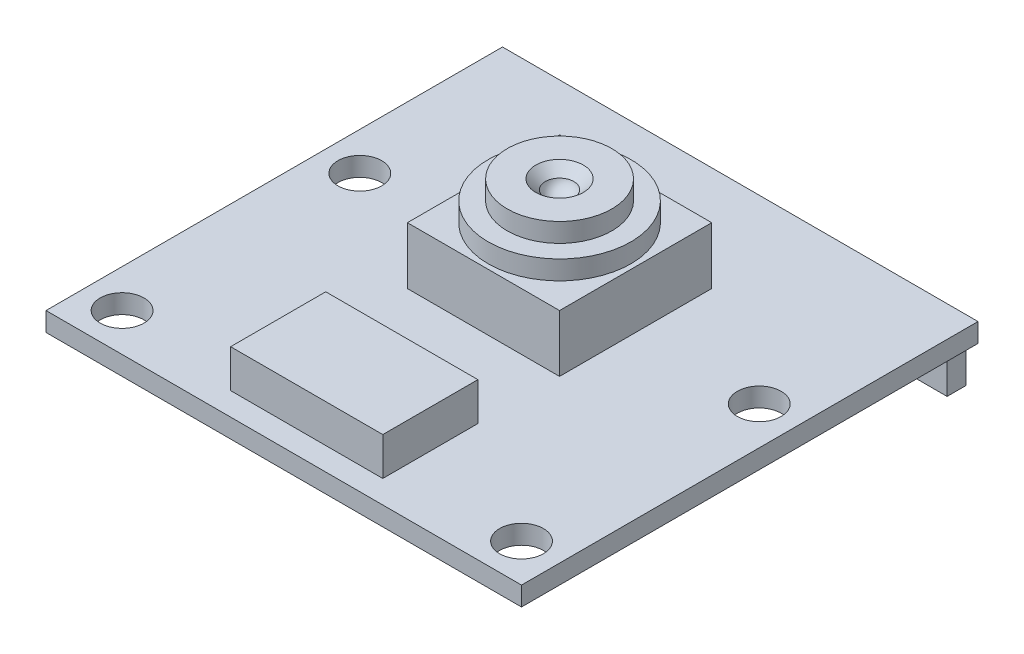
ISO-10303-21;
HEADER;
FILE_DESCRIPTION(('STEP AP214'),'2;1');
FILE_NAME('part.step','',(''),(''),'','','');
FILE_SCHEMA(('AUTOMOTIVE_DESIGN { 1 0 10303 214 1 1 1 1 }'));
ENDSEC;
DATA;
#1=APPLICATION_CONTEXT('core data for automotive mechanical design processes');
#2=APPLICATION_PROTOCOL_DEFINITION('international standard','automotive_design',2000,#1);
#3=PRODUCT_CONTEXT('',#1,'mechanical');
#4=PRODUCT('Part','Part','',(#3));
#5=PRODUCT_RELATED_PRODUCT_CATEGORY('part','',(#4));
#6=PRODUCT_DEFINITION_FORMATION('','',#4);
#7=PRODUCT_DEFINITION_CONTEXT('part definition',#1,'design');
#8=PRODUCT_DEFINITION('design','',#6,#7);
#9=PRODUCT_DEFINITION_SHAPE('','',#8);
#10=(LENGTH_UNIT() NAMED_UNIT(*) SI_UNIT(.MILLI.,.METRE.));
#11=(NAMED_UNIT(*) PLANE_ANGLE_UNIT() SI_UNIT($,.RADIAN.));
#12=(NAMED_UNIT(*) SI_UNIT($,.STERADIAN.) SOLID_ANGLE_UNIT());
#13=UNCERTAINTY_MEASURE_WITH_UNIT(LENGTH_MEASURE(1.E-05),#10,'distance_accuracy_value','');
#14=(GEOMETRIC_REPRESENTATION_CONTEXT(3) GLOBAL_UNCERTAINTY_ASSIGNED_CONTEXT((#13)) GLOBAL_UNIT_ASSIGNED_CONTEXT((#10,
#11,#12)) REPRESENTATION_CONTEXT('',''));
#15=CARTESIAN_POINT('',(0.,0.,0.));
#16=DIRECTION('',(0.,0.,1.));
#17=DIRECTION('',(1.,0.,0.));
#18=AXIS2_PLACEMENT_3D('',#15,#16,#17);
#19=CARTESIAN_POINT('',(0.,-2.,0.));
#20=DIRECTION('',(0.,1.,0.));
#21=DIRECTION('',(0.,0.,1.));
#22=AXIS2_PLACEMENT_3D('',#19,#20,#21);
#23=PLANE('',#22);
#24=DIRECTION('',(-1.,0.,0.));
#25=VECTOR('',#24,1.);
#26=CARTESIAN_POINT('',(12.,-2.,-10.875));
#27=LINE('',#26,#25);
#28=CARTESIAN_POINT('',(10.5,-2.,-10.875));
#29=VERTEX_POINT('',#28);
#30=CARTESIAN_POINT('',(-10.5,-2.,-10.875));
#31=VERTEX_POINT('',#30);
#32=EDGE_CURVE('E11',#29,#31,#27,.T.);
#33=ORIENTED_EDGE('',*,*,#32,.F.);
#34=DIRECTION('',(0.,0.,1.));
#35=VECTOR('',#34,1.);
#36=CARTESIAN_POINT('',(10.5,-2.,-10.875));
#37=LINE('',#36,#35);
#38=CARTESIAN_POINT('',(10.5,-2.,-6.625));
#39=VERTEX_POINT('',#38);
#40=EDGE_CURVE('E207',#29,#39,#37,.T.);
#41=ORIENTED_EDGE('',*,*,#40,.T.);
#42=DIRECTION('',(-1.,0.,0.));
#43=VECTOR('',#42,1.);
#44=CARTESIAN_POINT('',(10.5,-2.,-6.625));
#45=LINE('',#44,#43);
#46=CARTESIAN_POINT('',(-10.5,-2.,-6.625));
#47=VERTEX_POINT('',#46);
#48=EDGE_CURVE('E205',#39,#47,#45,.T.);
#49=ORIENTED_EDGE('',*,*,#48,.T.);
#50=DIRECTION('',(0.,0.,-1.));
#51=VECTOR('',#50,1.);
#52=CARTESIAN_POINT('',(-10.5,-2.,-10.875));
#53=LINE('',#52,#51);
#54=EDGE_CURVE('E183',#47,#31,#53,.T.);
#55=ORIENTED_EDGE('',*,*,#54,.T.);
#56=EDGE_LOOP('',(#33,#41,#49,#55));
#57=FACE_BOUND('',#56,.T.);
#58=ADVANCED_FACE('F35',(#57),#23,.F.);
#59=CARTESIAN_POINT('',(0.,0.,0.));
#60=DIRECTION('',(0.,1.,0.));
#61=DIRECTION('',(0.,0.,1.));
#62=AXIS2_PLACEMENT_3D('',#59,#60,#61);
#63=PLANE('',#62);
#64=DIRECTION('',(0.,0.,-1.));
#65=VECTOR('',#64,1.);
#66=CARTESIAN_POINT('',(12.5,0.,-12.));
#67=LINE('',#66,#65);
#68=CARTESIAN_POINT('',(12.5,0.,12.));
#69=VERTEX_POINT('',#68);
#70=CARTESIAN_POINT('',(12.5,0.,-12.));
#71=VERTEX_POINT('',#70);
#72=EDGE_CURVE('E328',#69,#71,#67,.T.);
#73=ORIENTED_EDGE('',*,*,#72,.F.);
#74=DIRECTION('',(1.,0.,0.));
#75=VECTOR('',#74,1.);
#76=CARTESIAN_POINT('',(-12.5,0.,12.));
#77=LINE('',#76,#75);
#78=CARTESIAN_POINT('',(-12.5,0.,12.));
#79=VERTEX_POINT('',#78);
#80=EDGE_CURVE('E335',#79,#69,#77,.T.);
#81=ORIENTED_EDGE('',*,*,#80,.F.);
#82=DIRECTION('',(0.,0.,1.));
#83=VECTOR('',#82,1.);
#84=CARTESIAN_POINT('',(-12.5,0.,-12.));
#85=LINE('',#84,#83);
#86=CARTESIAN_POINT('',(-12.5,0.,-12.));
#87=VERTEX_POINT('',#86);
#88=EDGE_CURVE('E346',#87,#79,#85,.T.);
#89=ORIENTED_EDGE('',*,*,#88,.F.);
#90=DIRECTION('',(-1.,0.,0.));
#91=VECTOR('',#90,1.);
#92=CARTESIAN_POINT('',(-12.5,0.,-12.));
#93=LINE('',#92,#91);
#94=EDGE_CURVE('E344',#71,#87,#93,.T.);
#95=ORIENTED_EDGE('',*,*,#94,.F.);
#96=EDGE_LOOP('',(#73,#81,#89,#95));
#97=FACE_BOUND('',#96,.T.);
#98=CARTESIAN_POINT('',(-10.5,0.,-2.5));
#99=DIRECTION('',(0.,1.,0.));
#100=DIRECTION('',(0.,0.,1.));
#101=AXIS2_PLACEMENT_3D('',#98,#99,#100);
#102=CIRCLE('',#101,1.15);
#103=CARTESIAN_POINT('',(-10.5,0.,-1.35));
#104=VERTEX_POINT('',#103);
#105=EDGE_CURVE('E325',#104,#104,#102,.T.);
#106=ORIENTED_EDGE('',*,*,#105,.T.);
#107=EDGE_LOOP('',(#106));
#108=FACE_BOUND('',#107,.T.);
#109=CARTESIAN_POINT('',(10.5,0.,-2.5));
#110=DIRECTION('',(0.,1.,0.));
#111=DIRECTION('',(0.,0.,1.));
#112=AXIS2_PLACEMENT_3D('',#109,#110,#111);
#113=CIRCLE('',#112,1.15);
#114=CARTESIAN_POINT('',(10.5,0.,-1.35));
#115=VERTEX_POINT('',#114);
#116=EDGE_CURVE('E319',#115,#115,#113,.T.);
#117=ORIENTED_EDGE('',*,*,#116,.T.);
#118=EDGE_LOOP('',(#117));
#119=FACE_BOUND('',#118,.T.);
#120=CARTESIAN_POINT('',(10.5,0.,10.));
#121=DIRECTION('',(0.,1.,0.));
#122=DIRECTION('',(0.,0.,1.));
#123=AXIS2_PLACEMENT_3D('',#120,#121,#122);
#124=CIRCLE('',#123,1.15);
#125=CARTESIAN_POINT('',(10.5,0.,11.15));
#126=VERTEX_POINT('',#125);
#127=EDGE_CURVE('E313',#126,#126,#124,.T.);
#128=ORIENTED_EDGE('',*,*,#127,.T.);
#129=EDGE_LOOP('',(#128));
#130=FACE_BOUND('',#129,.T.);
#131=CARTESIAN_POINT('',(-10.5,0.,10.));
#132=DIRECTION('',(0.,1.,0.));
#133=DIRECTION('',(0.,0.,1.));
#134=AXIS2_PLACEMENT_3D('',#131,#132,#133);
#135=CIRCLE('',#134,1.15);
#136=CARTESIAN_POINT('',(-10.5,0.,11.15));
#137=VERTEX_POINT('',#136);
#138=EDGE_CURVE('E307',#137,#137,#135,.T.);
#139=ORIENTED_EDGE('',*,*,#138,.T.);
#140=EDGE_LOOP('',(#139));
#141=FACE_BOUND('',#140,.T.);
#142=DIRECTION('',(-1.,0.,0.));
#143=VECTOR('',#142,1.);
#144=CARTESIAN_POINT('',(12.,0.,-10.875));
#145=LINE('',#144,#143);
#146=CARTESIAN_POINT('',(12.,0.,-10.875));
#147=VERTEX_POINT('',#146);
#148=CARTESIAN_POINT('',(10.5,0.,-10.875));
#149=VERTEX_POINT('',#148);
#150=EDGE_CURVE('E204',#147,#149,#145,.T.);
#151=ORIENTED_EDGE('',*,*,#150,.F.);
#152=DIRECTION('',(0.,0.,1.));
#153=VECTOR('',#152,1.);
#154=CARTESIAN_POINT('',(12.,0.,-11.875));
#155=LINE('',#154,#153);
#156=CARTESIAN_POINT('',(12.,0.,-11.875));
#157=VERTEX_POINT('',#156);
#158=EDGE_CURVE('E179',#157,#147,#155,.T.);
#159=ORIENTED_EDGE('',*,*,#158,.F.);
#160=DIRECTION('',(1.,0.,0.));
#161=VECTOR('',#160,1.);
#162=CARTESIAN_POINT('',(10.5,0.,-11.875));
#163=LINE('',#162,#161);
#164=CARTESIAN_POINT('',(-12.,0.,-11.875));
#165=VERTEX_POINT('',#164);
#166=EDGE_CURVE('E219',#165,#157,#163,.T.);
#167=ORIENTED_EDGE('',*,*,#166,.F.);
#168=DIRECTION('',(0.,0.,-1.));
#169=VECTOR('',#168,1.);
#170=CARTESIAN_POINT('',(-12.,0.,-11.875));
#171=LINE('',#170,#169);
#172=CARTESIAN_POINT('',(-12.,0.,-10.875));
#173=VERTEX_POINT('',#172);
#174=EDGE_CURVE('E216',#173,#165,#171,.T.);
#175=ORIENTED_EDGE('',*,*,#174,.F.);
#176=DIRECTION('',(-1.,0.,0.));
#177=VECTOR('',#176,1.);
#178=CARTESIAN_POINT('',(-12.,0.,-10.875));
#179=LINE('',#178,#177);
#180=CARTESIAN_POINT('',(-10.5,0.,-10.875));
#181=VERTEX_POINT('',#180);
#182=EDGE_CURVE('E214',#181,#173,#179,.T.);
#183=ORIENTED_EDGE('',*,*,#182,.F.);
#184=DIRECTION('',(0.,0.,-1.));
#185=VECTOR('',#184,1.);
#186=CARTESIAN_POINT('',(-10.5,0.,-10.875));
#187=LINE('',#186,#185);
#188=CARTESIAN_POINT('',(-10.5,0.,-6.625));
#189=VERTEX_POINT('',#188);
#190=EDGE_CURVE('E211',#189,#181,#187,.T.);
#191=ORIENTED_EDGE('',*,*,#190,.F.);
#192=DIRECTION('',(-1.,0.,0.));
#193=VECTOR('',#192,1.);
#194=CARTESIAN_POINT('',(10.5,0.,-6.625));
#195=LINE('',#194,#193);
#196=CARTESIAN_POINT('',(10.5,0.,-6.625));
#197=VERTEX_POINT('',#196);
#198=EDGE_CURVE('E57',#197,#189,#195,.T.);
#199=ORIENTED_EDGE('',*,*,#198,.F.);
#200=DIRECTION('',(0.,0.,1.));
#201=VECTOR('',#200,1.);
#202=CARTESIAN_POINT('',(10.5,0.,-10.875));
#203=LINE('',#202,#201);
#204=EDGE_CURVE('E52',#149,#197,#203,.T.);
#205=ORIENTED_EDGE('',*,*,#204,.F.);
#206=EDGE_LOOP('',(#151,#159,#167,#175,#183,#191,#199,#205));
#207=FACE_BOUND('',#206,.T.);
#208=ADVANCED_FACE('F384',(#97,#108,#119,#130,#141,#207),#63,.F.);
#209=CARTESIAN_POINT('',(0.,5.,-2.49999999999999));
#210=DIRECTION('',(0.,1.,0.));
#211=DIRECTION('',(0.,0.,1.));
#212=AXIS2_PLACEMENT_3D('',#209,#210,#211);
#213=PLANE('',#212);
#214=CARTESIAN_POINT('',(0.,5.,-2.49999999999999));
#215=DIRECTION('',(0.,1.,0.));
#216=DIRECTION('',(0.,0.,1.));
#217=AXIS2_PLACEMENT_3D('',#214,#215,#216);
#218=CIRCLE('',#217,3.75);
#219=CARTESIAN_POINT('',(0.,5.,1.25000000000001));
#220=VERTEX_POINT('',#219);
#221=EDGE_CURVE('E243',#220,#220,#218,.T.);
#222=ORIENTED_EDGE('',*,*,#221,.T.);
#223=EDGE_LOOP('',(#222));
#224=FACE_BOUND('',#223,.T.);
#225=CARTESIAN_POINT('',(0.,5.,-2.49999999999999));
#226=DIRECTION('',(0.,1.,0.));
#227=DIRECTION('',(0.,0.,1.));
#228=AXIS2_PLACEMENT_3D('',#225,#226,#227);
#229=CIRCLE('',#228,2.75);
#230=CARTESIAN_POINT('',(0.,5.,0.250000000000006));
#231=VERTEX_POINT('',#230);
#232=EDGE_CURVE('E240',#231,#231,#229,.T.);
#233=ORIENTED_EDGE('',*,*,#232,.F.);
#234=EDGE_LOOP('',(#233));
#235=FACE_BOUND('',#234,.T.);
#236=ADVANCED_FACE('F405',(#224,#235),#213,.T.);
#237=CARTESIAN_POINT('',(0.,4.,0.));
#238=DIRECTION('',(0.,1.,0.));
#239=DIRECTION('',(0.,0.,1.));
#240=AXIS2_PLACEMENT_3D('',#237,#238,#239);
#241=PLANE('',#240);
#242=DIRECTION('',(0.,0.,-1.));
#243=VECTOR('',#242,1.);
#244=CARTESIAN_POINT('',(4.,4.,-6.49999999999999));
#245=LINE('',#244,#243);
#246=CARTESIAN_POINT('',(4.,4.,1.50000000000001));
#247=VERTEX_POINT('',#246);
#248=CARTESIAN_POINT('',(4.,4.,-6.49999999999999));
#249=VERTEX_POINT('',#248);
#250=EDGE_CURVE('E249',#247,#249,#245,.T.);
#251=ORIENTED_EDGE('',*,*,#250,.T.);
#252=DIRECTION('',(-1.,0.,0.));
#253=VECTOR('',#252,1.);
#254=CARTESIAN_POINT('',(-4.,4.,-6.49999999999999));
#255=LINE('',#254,#253);
#256=CARTESIAN_POINT('',(-4.,4.,-6.49999999999999));
#257=VERTEX_POINT('',#256);
#258=EDGE_CURVE('E252',#249,#257,#255,.T.);
#259=ORIENTED_EDGE('',*,*,#258,.T.);
#260=DIRECTION('',(0.,0.,1.));
#261=VECTOR('',#260,1.);
#262=CARTESIAN_POINT('',(-4.,4.,-6.49999999999999));
#263=LINE('',#262,#261);
#264=CARTESIAN_POINT('',(-4.,4.,1.50000000000001));
#265=VERTEX_POINT('',#264);
#266=EDGE_CURVE('E255',#257,#265,#263,.T.);
#267=ORIENTED_EDGE('',*,*,#266,.T.);
#268=DIRECTION('',(1.,0.,0.));
#269=VECTOR('',#268,1.);
#270=CARTESIAN_POINT('',(-4.,4.,1.50000000000001));
#271=LINE('',#270,#269);
#272=EDGE_CURVE('E257',#265,#247,#271,.T.);
#273=ORIENTED_EDGE('',*,*,#272,.T.);
#274=EDGE_LOOP('',(#251,#259,#267,#273));
#275=FACE_BOUND('',#274,.T.);
#276=CARTESIAN_POINT('',(0.,4.,-2.49999999999999));
#277=DIRECTION('',(0.,1.,0.));
#278=DIRECTION('',(0.,0.,1.));
#279=AXIS2_PLACEMENT_3D('',#276,#277,#278);
#280=CIRCLE('',#279,3.75);
#281=CARTESIAN_POINT('',(0.,4.,1.25000000000001));
#282=VERTEX_POINT('',#281);
#283=EDGE_CURVE('E239',#282,#282,#280,.T.);
#284=ORIENTED_EDGE('',*,*,#283,.F.);
#285=EDGE_LOOP('',(#284));
#286=FACE_BOUND('',#285,.T.);
#287=ADVANCED_FACE('F439',(#275,#286),#241,.T.);
#288=CARTESIAN_POINT('',(0.,1.,0.));
#289=DIRECTION('',(0.,1.,0.));
#290=DIRECTION('',(0.,0.,1.));
#291=AXIS2_PLACEMENT_3D('',#288,#289,#290);
#292=PLANE('',#291);
#293=DIRECTION('',(-1.,0.,0.));
#294=VECTOR('',#293,1.);
#295=CARTESIAN_POINT('',(-3.99999999999999,1.,5.7933342708175));
#296=LINE('',#295,#294);
#297=CARTESIAN_POINT('',(4.00000000000001,1.,5.7933342708175));
#298=VERTEX_POINT('',#297);
#299=CARTESIAN_POINT('',(-3.99999999999999,1.,5.7933342708175));
#300=VERTEX_POINT('',#299);
#301=EDGE_CURVE('E291',#298,#300,#296,.T.);
#302=ORIENTED_EDGE('',*,*,#301,.F.);
#303=DIRECTION('',(0.,0.,-1.));
#304=VECTOR('',#303,1.);
#305=CARTESIAN_POINT('',(4.00000000000001,1.,5.7933342708175));
#306=LINE('',#305,#304);
#307=CARTESIAN_POINT('',(4.00000000000001,1.,10.7933342708175));
#308=VERTEX_POINT('',#307);
#309=EDGE_CURVE('E277',#308,#298,#306,.T.);
#310=ORIENTED_EDGE('',*,*,#309,.F.);
#311=DIRECTION('',(1.,0.,0.));
#312=VECTOR('',#311,1.);
#313=CARTESIAN_POINT('',(-3.99999999999999,1.,10.7933342708175));
#314=LINE('',#313,#312);
#315=CARTESIAN_POINT('',(-3.99999999999999,1.,10.7933342708175));
#316=VERTEX_POINT('',#315);
#317=EDGE_CURVE('E282',#316,#308,#314,.T.);
#318=ORIENTED_EDGE('',*,*,#317,.F.);
#319=DIRECTION('',(0.,0.,1.));
#320=VECTOR('',#319,1.);
#321=CARTESIAN_POINT('',(-3.99999999999999,1.,5.7933342708175));
#322=LINE('',#321,#320);
#323=EDGE_CURVE('E293',#300,#316,#322,.T.);
#324=ORIENTED_EDGE('',*,*,#323,.F.);
#325=EDGE_LOOP('',(#302,#310,#318,#324));
#326=FACE_BOUND('',#325,.T.);
#327=CARTESIAN_POINT('',(-10.5,1.,10.));
#328=DIRECTION('',(0.,1.,0.));
#329=DIRECTION('',(0.,0.,1.));
#330=AXIS2_PLACEMENT_3D('',#327,#328,#329);
#331=CIRCLE('',#330,1.15);
#332=CARTESIAN_POINT('',(-10.5,1.,11.15));
#333=VERTEX_POINT('',#332);
#334=EDGE_CURVE('E306',#333,#333,#331,.T.);
#335=ORIENTED_EDGE('',*,*,#334,.F.);
#336=EDGE_LOOP('',(#335));
#337=FACE_BOUND('',#336,.T.);
#338=CARTESIAN_POINT('',(10.5,1.,10.));
#339=DIRECTION('',(0.,1.,0.));
#340=DIRECTION('',(0.,0.,1.));
#341=AXIS2_PLACEMENT_3D('',#338,#339,#340);
#342=CIRCLE('',#341,1.15);
#343=CARTESIAN_POINT('',(10.5,1.,11.15));
#344=VERTEX_POINT('',#343);
#345=EDGE_CURVE('E310',#344,#344,#342,.T.);
#346=ORIENTED_EDGE('',*,*,#345,.F.);
#347=EDGE_LOOP('',(#346));
#348=FACE_BOUND('',#347,.T.);
#349=CARTESIAN_POINT('',(10.5,1.,-2.5));
#350=DIRECTION('',(0.,1.,0.));
#351=DIRECTION('',(0.,0.,1.));
#352=AXIS2_PLACEMENT_3D('',#349,#350,#351);
#353=CIRCLE('',#352,1.15);
#354=CARTESIAN_POINT('',(10.5,1.,-1.35));
#355=VERTEX_POINT('',#354);
#356=EDGE_CURVE('E316',#355,#355,#353,.T.);
#357=ORIENTED_EDGE('',*,*,#356,.F.);
#358=EDGE_LOOP('',(#357));
#359=FACE_BOUND('',#358,.T.);
#360=CARTESIAN_POINT('',(-10.5,1.,-2.5));
#361=DIRECTION('',(0.,1.,0.));
#362=DIRECTION('',(0.,0.,1.));
#363=AXIS2_PLACEMENT_3D('',#360,#361,#362);
#364=CIRCLE('',#363,1.15);
#365=CARTESIAN_POINT('',(-10.5,1.,-1.35));
#366=VERTEX_POINT('',#365);
#367=EDGE_CURVE('E322',#366,#366,#364,.T.);
#368=ORIENTED_EDGE('',*,*,#367,.F.);
#369=EDGE_LOOP('',(#368));
#370=FACE_BOUND('',#369,.T.);
#371=DIRECTION('',(0.,0.,-1.));
#372=VECTOR('',#371,1.);
#373=CARTESIAN_POINT('',(12.5,1.,-12.));
#374=LINE('',#373,#372);
#375=CARTESIAN_POINT('',(12.5,1.,12.));
#376=VERTEX_POINT('',#375);
#377=CARTESIAN_POINT('',(12.5,1.,-12.));
#378=VERTEX_POINT('',#377);
#379=EDGE_CURVE('E331',#376,#378,#374,.T.);
#380=ORIENTED_EDGE('',*,*,#379,.T.);
#381=DIRECTION('',(-1.,0.,0.));
#382=VECTOR('',#381,1.);
#383=CARTESIAN_POINT('',(-12.5,1.,-12.));
#384=LINE('',#383,#382);
#385=CARTESIAN_POINT('',(-12.5,1.,-12.));
#386=VERTEX_POINT('',#385);
#387=EDGE_CURVE('E334',#378,#386,#384,.T.);
#388=ORIENTED_EDGE('',*,*,#387,.T.);
#389=DIRECTION('',(0.,0.,1.));
#390=VECTOR('',#389,1.);
#391=CARTESIAN_POINT('',(-12.5,1.,-12.));
#392=LINE('',#391,#390);
#393=CARTESIAN_POINT('',(-12.5,1.,12.));
#394=VERTEX_POINT('',#393);
#395=EDGE_CURVE('E337',#386,#394,#392,.T.);
#396=ORIENTED_EDGE('',*,*,#395,.T.);
#397=DIRECTION('',(1.,0.,0.));
#398=VECTOR('',#397,1.);
#399=CARTESIAN_POINT('',(-12.5,1.,12.));
#400=LINE('',#399,#398);
#401=EDGE_CURVE('E339',#394,#376,#400,.T.);
#402=ORIENTED_EDGE('',*,*,#401,.T.);
#403=EDGE_LOOP('',(#380,#388,#396,#402));
#404=FACE_BOUND('',#403,.T.);
#405=DIRECTION('',(-1.,0.,0.));
#406=VECTOR('',#405,1.);
#407=CARTESIAN_POINT('',(-4.,1.,-6.49999999999999));
#408=LINE('',#407,#406);
#409=CARTESIAN_POINT('',(4.,1.,-6.49999999999999));
#410=VERTEX_POINT('',#409);
#411=CARTESIAN_POINT('',(-4.,1.,-6.49999999999999));
#412=VERTEX_POINT('',#411);
#413=EDGE_CURVE('E262',#410,#412,#408,.T.);
#414=ORIENTED_EDGE('',*,*,#413,.F.);
#415=DIRECTION('',(0.,0.,-1.));
#416=VECTOR('',#415,1.);
#417=CARTESIAN_POINT('',(4.,1.,-6.49999999999999));
#418=LINE('',#417,#416);
#419=CARTESIAN_POINT('',(4.,1.,1.50000000000001));
#420=VERTEX_POINT('',#419);
#421=EDGE_CURVE('E246',#420,#410,#418,.T.);
#422=ORIENTED_EDGE('',*,*,#421,.F.);
#423=DIRECTION('',(1.,0.,0.));
#424=VECTOR('',#423,1.);
#425=CARTESIAN_POINT('',(-4.,1.,1.50000000000001));
#426=LINE('',#425,#424);
#427=CARTESIAN_POINT('',(-4.,1.,1.50000000000001));
#428=VERTEX_POINT('',#427);
#429=EDGE_CURVE('E253',#428,#420,#426,.T.);
#430=ORIENTED_EDGE('',*,*,#429,.F.);
#431=DIRECTION('',(0.,0.,1.));
#432=VECTOR('',#431,1.);
#433=CARTESIAN_POINT('',(-4.,1.,-6.49999999999999));
#434=LINE('',#433,#432);
#435=EDGE_CURVE('E264',#412,#428,#434,.T.);
#436=ORIENTED_EDGE('',*,*,#435,.F.);
#437=EDGE_LOOP('',(#414,#422,#430,#436));
#438=FACE_BOUND('',#437,.T.);
#439=ADVANCED_FACE('F447',(#326,#337,#348,#359,#370,#404,#438),#292,.T.);
#440=CARTESIAN_POINT('',(12.5,1.,-12.));
#441=DIRECTION('',(-1.,0.,0.));
#442=DIRECTION('',(0.,0.,1.));
#443=AXIS2_PLACEMENT_3D('',#440,#441,#442);
#444=PLANE('',#443);
#445=ORIENTED_EDGE('',*,*,#72,.T.);
#446=DIRECTION('',(0.,-1.,0.));
#447=VECTOR('',#446,1.);
#448=CARTESIAN_POINT('',(12.5,1.,-12.));
#449=LINE('',#448,#447);
#450=EDGE_CURVE('E357',#378,#71,#449,.T.);
#451=ORIENTED_EDGE('',*,*,#450,.F.);
#452=ORIENTED_EDGE('',*,*,#379,.F.);
#453=DIRECTION('',(0.,-1.,0.));
#454=VECTOR('',#453,1.);
#455=CARTESIAN_POINT('',(12.5,1.,12.));
#456=LINE('',#455,#454);
#457=EDGE_CURVE('E341',#376,#69,#456,.T.);
#458=ORIENTED_EDGE('',*,*,#457,.T.);
#459=EDGE_LOOP('',(#445,#451,#452,#458));
#460=FACE_BOUND('',#459,.T.);
#461=ADVANCED_FACE('F502',(#460),#444,.F.);
#462=CARTESIAN_POINT('',(-12.5,1.,-12.));
#463=DIRECTION('',(0.,0.,1.));
#464=DIRECTION('',(1.,0.,0.));
#465=AXIS2_PLACEMENT_3D('',#462,#463,#464);
#466=PLANE('',#465);
#467=ORIENTED_EDGE('',*,*,#94,.T.);
#468=DIRECTION('',(0.,-1.,0.));
#469=VECTOR('',#468,1.);
#470=CARTESIAN_POINT('',(-12.5,1.,-12.));
#471=LINE('',#470,#469);
#472=EDGE_CURVE('E354',#386,#87,#471,.T.);
#473=ORIENTED_EDGE('',*,*,#472,.F.);
#474=ORIENTED_EDGE('',*,*,#387,.F.);
#475=ORIENTED_EDGE('',*,*,#450,.T.);
#476=EDGE_LOOP('',(#467,#473,#474,#475));
#477=FACE_BOUND('',#476,.T.);
#478=ADVANCED_FACE('F511',(#477),#466,.F.);
#479=CARTESIAN_POINT('',(-12.5,1.,-12.));
#480=DIRECTION('',(1.,0.,0.));
#481=DIRECTION('',(0.,0.,-1.));
#482=AXIS2_PLACEMENT_3D('',#479,#480,#481);
#483=PLANE('',#482);
#484=ORIENTED_EDGE('',*,*,#88,.T.);
#485=DIRECTION('',(0.,-1.,0.));
#486=VECTOR('',#485,1.);
#487=CARTESIAN_POINT('',(-12.5,1.,12.));
#488=LINE('',#487,#486);
#489=EDGE_CURVE('E351',#394,#79,#488,.T.);
#490=ORIENTED_EDGE('',*,*,#489,.F.);
#491=ORIENTED_EDGE('',*,*,#395,.F.);
#492=ORIENTED_EDGE('',*,*,#472,.T.);
#493=EDGE_LOOP('',(#484,#490,#491,#492));
#494=FACE_BOUND('',#493,.T.);
#495=ADVANCED_FACE('F507',(#494),#483,.F.);
#496=CARTESIAN_POINT('',(-12.5,1.,12.));
#497=DIRECTION('',(0.,0.,-1.));
#498=DIRECTION('',(-1.,0.,0.));
#499=AXIS2_PLACEMENT_3D('',#496,#497,#498);
#500=PLANE('',#499);
#501=ORIENTED_EDGE('',*,*,#80,.T.);
#502=ORIENTED_EDGE('',*,*,#457,.F.);
#503=ORIENTED_EDGE('',*,*,#401,.F.);
#504=ORIENTED_EDGE('',*,*,#489,.T.);
#505=EDGE_LOOP('',(#501,#502,#503,#504));
#506=FACE_BOUND('',#505,.T.);
#507=ADVANCED_FACE('F499',(#506),#500,.F.);
#508=CARTESIAN_POINT('',(-10.5,0.,-2.5));
#509=DIRECTION('',(0.,1.,0.));
#510=DIRECTION('',(0.,0.,1.));
#511=AXIS2_PLACEMENT_3D('',#508,#509,#510);
#512=CYLINDRICAL_SURFACE('',#511,1.15);
#513=ORIENTED_EDGE('',*,*,#105,.F.);
#514=EDGE_LOOP('',(#513));
#515=FACE_BOUND('',#514,.T.);
#516=ORIENTED_EDGE('',*,*,#367,.T.);
#517=EDGE_LOOP('',(#516));
#518=FACE_BOUND('',#517,.T.);
#519=ADVANCED_FACE('F495',(#515,#518),#512,.F.);
#520=CARTESIAN_POINT('',(10.5,0.,-2.5));
#521=DIRECTION('',(0.,1.,0.));
#522=DIRECTION('',(0.,0.,1.));
#523=AXIS2_PLACEMENT_3D('',#520,#521,#522);
#524=CYLINDRICAL_SURFACE('',#523,1.15);
#525=ORIENTED_EDGE('',*,*,#116,.F.);
#526=EDGE_LOOP('',(#525));
#527=FACE_BOUND('',#526,.T.);
#528=ORIENTED_EDGE('',*,*,#356,.T.);
#529=EDGE_LOOP('',(#528));
#530=FACE_BOUND('',#529,.T.);
#531=ADVANCED_FACE('F491',(#527,#530),#524,.F.);
#532=CARTESIAN_POINT('',(10.5,0.,10.));
#533=DIRECTION('',(0.,1.,0.));
#534=DIRECTION('',(0.,0.,1.));
#535=AXIS2_PLACEMENT_3D('',#532,#533,#534);
#536=CYLINDRICAL_SURFACE('',#535,1.15);
#537=ORIENTED_EDGE('',*,*,#127,.F.);
#538=EDGE_LOOP('',(#537));
#539=FACE_BOUND('',#538,.T.);
#540=ORIENTED_EDGE('',*,*,#345,.T.);
#541=EDGE_LOOP('',(#540));
#542=FACE_BOUND('',#541,.T.);
#543=ADVANCED_FACE('F487',(#539,#542),#536,.F.);
#544=CARTESIAN_POINT('',(-10.5,0.,10.));
#545=DIRECTION('',(0.,1.,0.));
#546=DIRECTION('',(0.,0.,1.));
#547=AXIS2_PLACEMENT_3D('',#544,#545,#546);
#548=CYLINDRICAL_SURFACE('',#547,1.15);
#549=ORIENTED_EDGE('',*,*,#138,.F.);
#550=EDGE_LOOP('',(#549));
#551=FACE_BOUND('',#550,.T.);
#552=ORIENTED_EDGE('',*,*,#334,.T.);
#553=EDGE_LOOP('',(#552));
#554=FACE_BOUND('',#553,.T.);
#555=ADVANCED_FACE('F483',(#551,#554),#548,.F.);
#556=CARTESIAN_POINT('',(4.00000000000001,3.,5.7933342708175));
#557=DIRECTION('',(-1.,0.,0.));
#558=DIRECTION('',(0.,0.,1.));
#559=AXIS2_PLACEMENT_3D('',#556,#557,#558);
#560=PLANE('',#559);
#561=ORIENTED_EDGE('',*,*,#309,.T.);
#562=DIRECTION('',(0.,-1.,0.));
#563=VECTOR('',#562,1.);
#564=CARTESIAN_POINT('',(4.00000000000001,3.,5.7933342708175));
#565=LINE('',#564,#563);
#566=CARTESIAN_POINT('',(4.00000000000001,3.,5.7933342708175));
#567=VERTEX_POINT('',#566);
#568=EDGE_CURVE('E304',#567,#298,#565,.T.);
#569=ORIENTED_EDGE('',*,*,#568,.F.);
#570=DIRECTION('',(0.,0.,-1.));
#571=VECTOR('',#570,1.);
#572=CARTESIAN_POINT('',(4.00000000000001,3.,5.7933342708175));
#573=LINE('',#572,#571);
#574=CARTESIAN_POINT('',(4.00000000000001,3.,10.7933342708175));
#575=VERTEX_POINT('',#574);
#576=EDGE_CURVE('E278',#575,#567,#573,.T.);
#577=ORIENTED_EDGE('',*,*,#576,.F.);
#578=DIRECTION('',(0.,-1.,0.));
#579=VECTOR('',#578,1.);
#580=CARTESIAN_POINT('',(4.00000000000001,3.,10.7933342708175));
#581=LINE('',#580,#579);
#582=EDGE_CURVE('E288',#575,#308,#581,.T.);
#583=ORIENTED_EDGE('',*,*,#582,.T.);
#584=EDGE_LOOP('',(#561,#569,#577,#583));
#585=FACE_BOUND('',#584,.T.);
#586=ADVANCED_FACE('F479',(#585),#560,.F.);
#587=CARTESIAN_POINT('',(-3.99999999999999,3.,5.7933342708175));
#588=DIRECTION('',(0.,0.,1.));
#589=DIRECTION('',(1.,0.,0.));
#590=AXIS2_PLACEMENT_3D('',#587,#588,#589);
#591=PLANE('',#590);
#592=ORIENTED_EDGE('',*,*,#301,.T.);
#593=DIRECTION('',(0.,-1.,0.));
#594=VECTOR('',#593,1.);
#595=CARTESIAN_POINT('',(-3.99999999999999,3.,5.7933342708175));
#596=LINE('',#595,#594);
#597=CARTESIAN_POINT('',(-3.99999999999999,3.,5.7933342708175));
#598=VERTEX_POINT('',#597);
#599=EDGE_CURVE('E301',#598,#300,#596,.T.);
#600=ORIENTED_EDGE('',*,*,#599,.F.);
#601=DIRECTION('',(-1.,0.,0.));
#602=VECTOR('',#601,1.);
#603=CARTESIAN_POINT('',(-3.99999999999999,3.,5.7933342708175));
#604=LINE('',#603,#602);
#605=EDGE_CURVE('E281',#567,#598,#604,.T.);
#606=ORIENTED_EDGE('',*,*,#605,.F.);
#607=ORIENTED_EDGE('',*,*,#568,.T.);
#608=EDGE_LOOP('',(#592,#600,#606,#607));
#609=FACE_BOUND('',#608,.T.);
#610=ADVANCED_FACE('F475',(#609),#591,.F.);
#611=CARTESIAN_POINT('',(-3.99999999999999,3.,5.7933342708175));
#612=DIRECTION('',(1.,0.,0.));
#613=DIRECTION('',(0.,0.,-1.));
#614=AXIS2_PLACEMENT_3D('',#611,#612,#613);
#615=PLANE('',#614);
#616=ORIENTED_EDGE('',*,*,#323,.T.);
#617=DIRECTION('',(0.,-1.,0.));
#618=VECTOR('',#617,1.);
#619=CARTESIAN_POINT('',(-3.99999999999999,3.,10.7933342708175));
#620=LINE('',#619,#618);
#621=CARTESIAN_POINT('',(-3.99999999999999,3.,10.7933342708175));
#622=VERTEX_POINT('',#621);
#623=EDGE_CURVE('E299',#622,#316,#620,.T.);
#624=ORIENTED_EDGE('',*,*,#623,.F.);
#625=DIRECTION('',(0.,0.,1.));
#626=VECTOR('',#625,1.);
#627=CARTESIAN_POINT('',(-3.99999999999999,3.,5.7933342708175));
#628=LINE('',#627,#626);
#629=EDGE_CURVE('E284',#598,#622,#628,.T.);
#630=ORIENTED_EDGE('',*,*,#629,.F.);
#631=ORIENTED_EDGE('',*,*,#599,.T.);
#632=EDGE_LOOP('',(#616,#624,#630,#631));
#633=FACE_BOUND('',#632,.T.);
#634=ADVANCED_FACE('F471',(#633),#615,.F.);
#635=CARTESIAN_POINT('',(-3.99999999999999,3.,10.7933342708175));
#636=DIRECTION('',(0.,0.,-1.));
#637=DIRECTION('',(-1.,0.,0.));
#638=AXIS2_PLACEMENT_3D('',#635,#636,#637);
#639=PLANE('',#638);
#640=ORIENTED_EDGE('',*,*,#317,.T.);
#641=ORIENTED_EDGE('',*,*,#582,.F.);
#642=DIRECTION('',(1.,0.,0.));
#643=VECTOR('',#642,1.);
#644=CARTESIAN_POINT('',(-3.99999999999999,3.,10.7933342708175));
#645=LINE('',#644,#643);
#646=EDGE_CURVE('E286',#622,#575,#645,.T.);
#647=ORIENTED_EDGE('',*,*,#646,.F.);
#648=ORIENTED_EDGE('',*,*,#623,.T.);
#649=EDGE_LOOP('',(#640,#641,#647,#648));
#650=FACE_BOUND('',#649,.T.);
#651=ADVANCED_FACE('F467',(#650),#639,.F.);
#652=CARTESIAN_POINT('',(0.,3.,0.));
#653=DIRECTION('',(0.,1.,0.));
#654=DIRECTION('',(0.,0.,1.));
#655=AXIS2_PLACEMENT_3D('',#652,#653,#654);
#656=PLANE('',#655);
#657=ORIENTED_EDGE('',*,*,#576,.T.);
#658=ORIENTED_EDGE('',*,*,#605,.T.);
#659=ORIENTED_EDGE('',*,*,#629,.T.);
#660=ORIENTED_EDGE('',*,*,#646,.T.);
#661=EDGE_LOOP('',(#657,#658,#659,#660));
#662=FACE_BOUND('',#661,.T.);
#663=ADVANCED_FACE('F463',(#662),#656,.T.);
#664=CARTESIAN_POINT('',(4.,4.,-6.49999999999999));
#665=DIRECTION('',(-1.,0.,0.));
#666=DIRECTION('',(0.,0.,1.));
#667=AXIS2_PLACEMENT_3D('',#664,#665,#666);
#668=PLANE('',#667);
#669=ORIENTED_EDGE('',*,*,#421,.T.);
#670=DIRECTION('',(0.,-1.,0.));
#671=VECTOR('',#670,1.);
#672=CARTESIAN_POINT('',(4.,4.,-6.49999999999999));
#673=LINE('',#672,#671);
#674=EDGE_CURVE('E275',#249,#410,#673,.T.);
#675=ORIENTED_EDGE('',*,*,#674,.F.);
#676=ORIENTED_EDGE('',*,*,#250,.F.);
#677=DIRECTION('',(0.,-1.,0.));
#678=VECTOR('',#677,1.);
#679=CARTESIAN_POINT('',(4.,4.,1.50000000000001));
#680=LINE('',#679,#678);
#681=EDGE_CURVE('E259',#247,#420,#680,.T.);
#682=ORIENTED_EDGE('',*,*,#681,.T.);
#683=EDGE_LOOP('',(#669,#675,#676,#682));
#684=FACE_BOUND('',#683,.T.);
#685=ADVANCED_FACE('F459',(#684),#668,.F.);
#686=CARTESIAN_POINT('',(-4.,4.,-6.49999999999999));
#687=DIRECTION('',(0.,0.,1.));
#688=DIRECTION('',(1.,0.,0.));
#689=AXIS2_PLACEMENT_3D('',#686,#687,#688);
#690=PLANE('',#689);
#691=ORIENTED_EDGE('',*,*,#413,.T.);
#692=DIRECTION('',(0.,-1.,0.));
#693=VECTOR('',#692,1.);
#694=CARTESIAN_POINT('',(-4.,4.,-6.49999999999999));
#695=LINE('',#694,#693);
#696=EDGE_CURVE('E272',#257,#412,#695,.T.);
#697=ORIENTED_EDGE('',*,*,#696,.F.);
#698=ORIENTED_EDGE('',*,*,#258,.F.);
#699=ORIENTED_EDGE('',*,*,#674,.T.);
#700=EDGE_LOOP('',(#691,#697,#698,#699));
#701=FACE_BOUND('',#700,.T.);
#702=ADVANCED_FACE('F455',(#701),#690,.F.);
#703=CARTESIAN_POINT('',(-4.,4.,-6.49999999999999));
#704=DIRECTION('',(1.,0.,0.));
#705=DIRECTION('',(0.,0.,-1.));
#706=AXIS2_PLACEMENT_3D('',#703,#704,#705);
#707=PLANE('',#706);
#708=ORIENTED_EDGE('',*,*,#435,.T.);
#709=DIRECTION('',(0.,-1.,0.));
#710=VECTOR('',#709,1.);
#711=CARTESIAN_POINT('',(-4.,4.,1.50000000000001));
#712=LINE('',#711,#710);
#713=EDGE_CURVE('E270',#265,#428,#712,.T.);
#714=ORIENTED_EDGE('',*,*,#713,.F.);
#715=ORIENTED_EDGE('',*,*,#266,.F.);
#716=ORIENTED_EDGE('',*,*,#696,.T.);
#717=EDGE_LOOP('',(#708,#714,#715,#716));
#718=FACE_BOUND('',#717,.T.);
#719=ADVANCED_FACE('F451',(#718),#707,.F.);
#720=CARTESIAN_POINT('',(-4.,4.,1.50000000000001));
#721=DIRECTION('',(0.,0.,-1.));
#722=DIRECTION('',(-1.,0.,0.));
#723=AXIS2_PLACEMENT_3D('',#720,#721,#722);
#724=PLANE('',#723);
#725=ORIENTED_EDGE('',*,*,#429,.T.);
#726=ORIENTED_EDGE('',*,*,#681,.F.);
#727=ORIENTED_EDGE('',*,*,#272,.F.);
#728=ORIENTED_EDGE('',*,*,#713,.T.);
#729=EDGE_LOOP('',(#725,#726,#727,#728));
#730=FACE_BOUND('',#729,.T.);
#731=ADVANCED_FACE('F443',(#730),#724,.F.);
#732=CARTESIAN_POINT('',(0.,5.,-2.49999999999999));
#733=DIRECTION('',(0.,-1.,0.));
#734=DIRECTION('',(0.,0.,-1.));
#735=AXIS2_PLACEMENT_3D('',#732,#733,#734);
#736=CYLINDRICAL_SURFACE('',#735,3.75);
#737=ORIENTED_EDGE('',*,*,#221,.F.);
#738=EDGE_LOOP('',(#737));
#739=FACE_BOUND('',#738,.T.);
#740=ORIENTED_EDGE('',*,*,#283,.T.);
#741=EDGE_LOOP('',(#740));
#742=FACE_BOUND('',#741,.T.);
#743=ADVANCED_FACE('F435',(#739,#742),#736,.T.);
#744=CARTESIAN_POINT('',(0.,6.,-2.49999999999999));
#745=DIRECTION('',(0.,-1.,0.));
#746=DIRECTION('',(0.,0.,-1.));
#747=AXIS2_PLACEMENT_3D('',#744,#745,#746);
#748=CYLINDRICAL_SURFACE('',#747,2.75);
#749=CARTESIAN_POINT('',(0.,6.,-2.49999999999999));
#750=DIRECTION('',(0.,1.,0.));
#751=DIRECTION('',(0.,0.,1.));
#752=AXIS2_PLACEMENT_3D('',#749,#750,#751);
#753=CIRCLE('',#752,2.75);
#754=CARTESIAN_POINT('',(0.,6.,0.250000000000006));
#755=VERTEX_POINT('',#754);
#756=EDGE_CURVE('E236',#755,#755,#753,.T.);
#757=ORIENTED_EDGE('',*,*,#756,.F.);
#758=EDGE_LOOP('',(#757));
#759=FACE_BOUND('',#758,.T.);
#760=ORIENTED_EDGE('',*,*,#232,.T.);
#761=EDGE_LOOP('',(#760));
#762=FACE_BOUND('',#761,.T.);
#763=ADVANCED_FACE('F431',(#759,#762),#748,.T.);
#764=CARTESIAN_POINT('',(0.,6.,-2.49999999999999));
#765=DIRECTION('',(0.,1.,0.));
#766=DIRECTION('',(0.,0.,1.));
#767=AXIS2_PLACEMENT_3D('',#764,#765,#766);
#768=PLANE('',#767);
#769=CARTESIAN_POINT('',(0.,6.,-2.49999999999999));
#770=DIRECTION('',(0.,1.,0.));
#771=DIRECTION('',(0.,0.,1.));
#772=AXIS2_PLACEMENT_3D('',#769,#770,#771);
#773=CIRCLE('',#772,1.25);
#774=CARTESIAN_POINT('',(0.,6.,-1.25));
#775=VERTEX_POINT('',#774);
#776=EDGE_CURVE('E363',#775,#775,#773,.F.);
#777=ORIENTED_EDGE('',*,*,#776,.T.);
#778=EDGE_LOOP('',(#777));
#779=FACE_BOUND('',#778,.T.);
#780=ORIENTED_EDGE('',*,*,#756,.T.);
#781=EDGE_LOOP('',(#780));
#782=FACE_BOUND('',#781,.T.);
#783=ADVANCED_FACE('F427',(#779,#782),#768,.T.);
#784=CARTESIAN_POINT('',(0.,5.,-2.49999999999999));
#785=DIRECTION('',(0.,1.,0.));
#786=DIRECTION('',(0.,0.,1.));
#787=AXIS2_PLACEMENT_3D('',#784,#785,#786);
#788=PLANE('',#787);
#789=CARTESIAN_POINT('',(0.,5.,-2.49999999999999));
#790=DIRECTION('',(0.,1.,0.));
#791=DIRECTION('',(0.,0.,1.));
#792=AXIS2_PLACEMENT_3D('',#789,#790,#791);
#793=CIRCLE('',#792,0.0791796067500625);
#794=CARTESIAN_POINT('',(0.,5.,-2.42082039324993));
#795=VERTEX_POINT('',#794);
#796=EDGE_CURVE('E44',#795,#795,#793,.T.);
#797=ORIENTED_EDGE('',*,*,#796,.T.);
#798=EDGE_LOOP('',(#797));
#799=FACE_BOUND('',#798,.T.);
#800=ADVANCED_FACE('F423',(#799),#788,.T.);
#801=CARTESIAN_POINT('',(0.,5.5,-2.49999999999999));
#802=DIRECTION('',(0.,1.,0.));
#803=DIRECTION('',(0.,0.,1.));
#804=AXIS2_PLACEMENT_3D('',#801,#802,#803);
#805=CONICAL_SURFACE('',#804,0.75,0.785398163397449);
#806=ORIENTED_EDGE('',*,*,#776,.F.);
#807=EDGE_LOOP('',(#806));
#808=FACE_BOUND('',#807,.T.);
#809=CARTESIAN_POINT('',(0.,5.5,-2.49999999999999));
#810=DIRECTION('',(0.,1.,0.));
#811=DIRECTION('',(0.,0.,1.));
#812=AXIS2_PLACEMENT_3D('',#809,#810,#811);
#813=CIRCLE('',#812,0.75);
#814=CARTESIAN_POINT('',(0.,5.5,-1.74999999999999));
#815=VERTEX_POINT('',#814);
#816=EDGE_CURVE('E360',#815,#815,#813,.T.);
#817=ORIENTED_EDGE('',*,*,#816,.F.);
#818=EDGE_LOOP('',(#817));
#819=FACE_BOUND('',#818,.T.);
#820=ADVANCED_FACE('F426',(#808,#819),#805,.F.);
#821=CARTESIAN_POINT('',(0.,5.7,-2.49999999999999));
#822=DIRECTION('',(0.,-1.,0.));
#823=DIRECTION('',(0.,0.,-1.));
#824=AXIS2_PLACEMENT_3D('',#821,#822,#823);
#825=DEGENERATE_TOROIDAL_SURFACE('',#824,0.0791796067500625,0.7,.T.);
#826=ORIENTED_EDGE('',*,*,#816,.T.);
#827=EDGE_LOOP('',(#826));
#828=FACE_BOUND('',#827,.T.);
#829=ORIENTED_EDGE('',*,*,#796,.F.);
#830=EDGE_LOOP('',(#829));
#831=FACE_BOUND('',#830,.T.);
#832=ADVANCED_FACE('F37',(#828,#831),#825,.F.);
#833=CARTESIAN_POINT('',(12.,-2.,-10.875));
#834=DIRECTION('',(0.,0.,-1.));
#835=DIRECTION('',(-1.,0.,0.));
#836=AXIS2_PLACEMENT_3D('',#833,#834,#835);
#837=PLANE('',#836);
#838=ORIENTED_EDGE('',*,*,#150,.T.);
#839=DIRECTION('',(0.,1.,0.));
#840=VECTOR('',#839,1.);
#841=CARTESIAN_POINT('',(10.5,-2.,-10.875));
#842=LINE('',#841,#840);
#843=EDGE_CURVE('E235',#29,#149,#842,.T.);
#844=ORIENTED_EDGE('',*,*,#843,.F.);
#845=ORIENTED_EDGE('',*,*,#32,.T.);
#846=DIRECTION('',(0.,1.,0.));
#847=VECTOR('',#846,1.);
#848=CARTESIAN_POINT('',(-10.5,-2.,-10.875));
#849=LINE('',#848,#847);
#850=EDGE_CURVE('E228',#31,#181,#849,.T.);
#851=ORIENTED_EDGE('',*,*,#850,.T.);
#852=ORIENTED_EDGE('',*,*,#182,.T.);
#853=DIRECTION('',(0.,1.,0.));
#854=VECTOR('',#853,1.);
#855=CARTESIAN_POINT('',(-12.,-2.,-10.875));
#856=LINE('',#855,#854);
#857=CARTESIAN_POINT('',(-12.,-2.1,-10.875));
#858=VERTEX_POINT('',#857);
#859=EDGE_CURVE('E190',#858,#173,#856,.T.);
#860=ORIENTED_EDGE('',*,*,#859,.F.);
#861=DIRECTION('',(-1.,0.,0.));
#862=VECTOR('',#861,1.);
#863=CARTESIAN_POINT('',(12.,-2.1,-10.875));
#864=LINE('',#863,#862);
#865=CARTESIAN_POINT('',(12.,-2.1,-10.875));
#866=VERTEX_POINT('',#865);
#867=EDGE_CURVE('E186',#866,#858,#864,.T.);
#868=ORIENTED_EDGE('',*,*,#867,.F.);
#869=DIRECTION('',(0.,1.,0.));
#870=VECTOR('',#869,1.);
#871=CARTESIAN_POINT('',(12.,-2.,-10.875));
#872=LINE('',#871,#870);
#873=EDGE_CURVE('E173',#866,#147,#872,.T.);
#874=ORIENTED_EDGE('',*,*,#873,.T.);
#875=EDGE_LOOP('',(#838,#844,#845,#851,#852,#860,#868,#874));
#876=FACE_BOUND('',#875,.T.);
#877=ADVANCED_FACE('F187',(#876),#837,.F.);
#878=CARTESIAN_POINT('',(10.5,-2.,-10.875));
#879=DIRECTION('',(-1.,0.,0.));
#880=DIRECTION('',(0.,0.,1.));
#881=AXIS2_PLACEMENT_3D('',#878,#879,#880);
#882=PLANE('',#881);
#883=ORIENTED_EDGE('',*,*,#204,.T.);
#884=DIRECTION('',(0.,1.,0.));
#885=VECTOR('',#884,1.);
#886=CARTESIAN_POINT('',(10.5,-2.,-6.625));
#887=LINE('',#886,#885);
#888=EDGE_CURVE('E232',#39,#197,#887,.T.);
#889=ORIENTED_EDGE('',*,*,#888,.F.);
#890=ORIENTED_EDGE('',*,*,#40,.F.);
#891=ORIENTED_EDGE('',*,*,#843,.T.);
#892=EDGE_LOOP('',(#883,#889,#890,#891));
#893=FACE_BOUND('',#892,.T.);
#894=ADVANCED_FACE('F382',(#893),#882,.F.);
#895=CARTESIAN_POINT('',(10.5,-2.,-6.625));
#896=DIRECTION('',(0.,0.,-1.));
#897=DIRECTION('',(-1.,0.,0.));
#898=AXIS2_PLACEMENT_3D('',#895,#896,#897);
#899=PLANE('',#898);
#900=ORIENTED_EDGE('',*,*,#198,.T.);
#901=DIRECTION('',(0.,1.,0.));
#902=VECTOR('',#901,1.);
#903=CARTESIAN_POINT('',(-10.5,-2.,-6.625));
#904=LINE('',#903,#902);
#905=EDGE_CURVE('E229',#47,#189,#904,.T.);
#906=ORIENTED_EDGE('',*,*,#905,.F.);
#907=ORIENTED_EDGE('',*,*,#48,.F.);
#908=ORIENTED_EDGE('',*,*,#888,.T.);
#909=EDGE_LOOP('',(#900,#906,#907,#908));
#910=FACE_BOUND('',#909,.T.);
#911=ADVANCED_FACE('F395',(#910),#899,.F.);
#912=CARTESIAN_POINT('',(-10.5,-2.,-10.875));
#913=DIRECTION('',(1.,0.,0.));
#914=DIRECTION('',(0.,0.,-1.));
#915=AXIS2_PLACEMENT_3D('',#912,#913,#914);
#916=PLANE('',#915);
#917=ORIENTED_EDGE('',*,*,#190,.T.);
#918=ORIENTED_EDGE('',*,*,#850,.F.);
#919=ORIENTED_EDGE('',*,*,#54,.F.);
#920=ORIENTED_EDGE('',*,*,#905,.T.);
#921=EDGE_LOOP('',(#917,#918,#919,#920));
#922=FACE_BOUND('',#921,.T.);
#923=ADVANCED_FACE('F392',(#922),#916,.F.);
#924=CARTESIAN_POINT('',(-12.,-2.,-11.875));
#925=DIRECTION('',(1.,0.,0.));
#926=DIRECTION('',(0.,0.,-1.));
#927=AXIS2_PLACEMENT_3D('',#924,#925,#926);
#928=PLANE('',#927);
#929=ORIENTED_EDGE('',*,*,#174,.T.);
#930=DIRECTION('',(0.,1.,0.));
#931=VECTOR('',#930,1.);
#932=CARTESIAN_POINT('',(-12.,-2.,-11.875));
#933=LINE('',#932,#931);
#934=CARTESIAN_POINT('',(-12.,-2.1,-11.875));
#935=VERTEX_POINT('',#934);
#936=EDGE_CURVE('E224',#935,#165,#933,.T.);
#937=ORIENTED_EDGE('',*,*,#936,.F.);
#938=DIRECTION('',(0.,0.,-1.));
#939=VECTOR('',#938,1.);
#940=CARTESIAN_POINT('',(-12.,-2.1,-11.875));
#941=LINE('',#940,#939);
#942=EDGE_CURVE('E194',#858,#935,#941,.T.);
#943=ORIENTED_EDGE('',*,*,#942,.F.);
#944=ORIENTED_EDGE('',*,*,#859,.T.);
#945=EDGE_LOOP('',(#929,#937,#943,#944));
#946=FACE_BOUND('',#945,.T.);
#947=ADVANCED_FACE('F388',(#946),#928,.F.);
#948=CARTESIAN_POINT('',(10.5,-2.,-11.875));
#949=DIRECTION('',(0.,0.,1.));
#950=DIRECTION('',(1.,0.,0.));
#951=AXIS2_PLACEMENT_3D('',#948,#949,#950);
#952=PLANE('',#951);
#953=ORIENTED_EDGE('',*,*,#166,.T.);
#954=DIRECTION('',(0.,1.,0.));
#955=VECTOR('',#954,1.);
#956=CARTESIAN_POINT('',(12.,-2.,-11.875));
#957=LINE('',#956,#955);
#958=CARTESIAN_POINT('',(12.,-2.1,-11.875));
#959=VERTEX_POINT('',#958);
#960=EDGE_CURVE('E182',#959,#157,#957,.T.);
#961=ORIENTED_EDGE('',*,*,#960,.F.);
#962=DIRECTION('',(1.,0.,0.));
#963=VECTOR('',#962,1.);
#964=CARTESIAN_POINT('',(12.,-2.1,-11.875));
#965=LINE('',#964,#963);
#966=EDGE_CURVE('E199',#935,#959,#965,.T.);
#967=ORIENTED_EDGE('',*,*,#966,.F.);
#968=ORIENTED_EDGE('',*,*,#936,.T.);
#969=EDGE_LOOP('',(#953,#961,#967,#968));
#970=FACE_BOUND('',#969,.T.);
#971=ADVANCED_FACE('F386',(#970),#952,.F.);
#972=CARTESIAN_POINT('',(12.,-2.,-11.875));
#973=DIRECTION('',(-1.,0.,0.));
#974=DIRECTION('',(0.,0.,1.));
#975=AXIS2_PLACEMENT_3D('',#972,#973,#974);
#976=PLANE('',#975);
#977=ORIENTED_EDGE('',*,*,#158,.T.);
#978=ORIENTED_EDGE('',*,*,#873,.F.);
#979=DIRECTION('',(0.,0.,1.));
#980=VECTOR('',#979,1.);
#981=CARTESIAN_POINT('',(12.,-2.1,-11.875));
#982=LINE('',#981,#980);
#983=EDGE_CURVE('E178',#959,#866,#982,.T.);
#984=ORIENTED_EDGE('',*,*,#983,.F.);
#985=ORIENTED_EDGE('',*,*,#960,.T.);
#986=EDGE_LOOP('',(#977,#978,#984,#985));
#987=FACE_BOUND('',#986,.T.);
#988=ADVANCED_FACE('F175',(#987),#976,.F.);
#989=CARTESIAN_POINT('',(0.,-2.1,0.));
#990=DIRECTION('',(0.,-1.,0.));
#991=DIRECTION('',(0.,0.,-1.));
#992=AXIS2_PLACEMENT_3D('',#989,#990,#991);
#993=PLANE('',#992);
#994=ORIENTED_EDGE('',*,*,#983,.T.);
#995=ORIENTED_EDGE('',*,*,#867,.T.);
#996=ORIENTED_EDGE('',*,*,#942,.T.);
#997=ORIENTED_EDGE('',*,*,#966,.T.);
#998=EDGE_LOOP('',(#994,#995,#996,#997));
#999=FACE_BOUND('',#998,.T.);
#1000=ADVANCED_FACE('F197',(#999),#993,.T.);
#1001=CLOSED_SHELL('',(#58,#208,#236,#287,#439,#461,#478,#495,#507,#519,#531,#543,#555,#586,
#610,#634,#651,#663,#685,#702,#719,#731,#743,#763,#783,#800,#820,#832,#877,#894,#911,#923,#947,
#971,#988,#1000));
#1002=MANIFOLD_SOLID_BREP('B2',#1001);
#1003=ADVANCED_BREP_SHAPE_REPRESENTATION('',(#18,#1002),#14);
#1004=SHAPE_DEFINITION_REPRESENTATION(#9,#1003);
ENDSEC;
END-ISO-10303-21;
